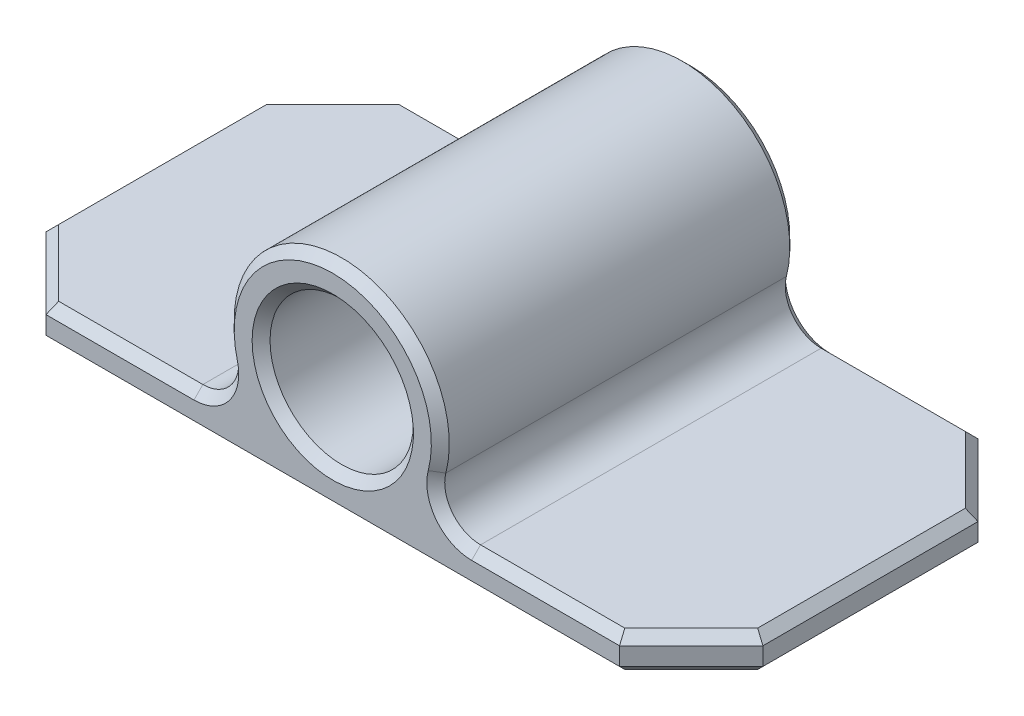
ISO-10303-21;
HEADER;
FILE_DESCRIPTION(('STEP AP214'),'2;1');
FILE_NAME('part.step','',(''),(''),'','','');
FILE_SCHEMA(('AUTOMOTIVE_DESIGN { 1 0 10303 214 1 1 1 1 }'));
ENDSEC;
DATA;
#1=APPLICATION_CONTEXT('core data for automotive mechanical design processes');
#2=APPLICATION_PROTOCOL_DEFINITION('international standard','automotive_design',2000,#1);
#3=PRODUCT_CONTEXT('',#1,'mechanical');
#4=PRODUCT('Part','Part','',(#3));
#5=PRODUCT_RELATED_PRODUCT_CATEGORY('part','',(#4));
#6=PRODUCT_DEFINITION_FORMATION('','',#4);
#7=PRODUCT_DEFINITION_CONTEXT('part definition',#1,'design');
#8=PRODUCT_DEFINITION('design','',#6,#7);
#9=PRODUCT_DEFINITION_SHAPE('','',#8);
#10=(LENGTH_UNIT() NAMED_UNIT(*) SI_UNIT(.MILLI.,.METRE.));
#11=(NAMED_UNIT(*) PLANE_ANGLE_UNIT() SI_UNIT($,.RADIAN.));
#12=(NAMED_UNIT(*) SI_UNIT($,.STERADIAN.) SOLID_ANGLE_UNIT());
#13=UNCERTAINTY_MEASURE_WITH_UNIT(LENGTH_MEASURE(1.E-05),#10,'distance_accuracy_value','');
#14=(GEOMETRIC_REPRESENTATION_CONTEXT(3) GLOBAL_UNCERTAINTY_ASSIGNED_CONTEXT((#13)) GLOBAL_UNIT_ASSIGNED_CONTEXT((#10,
#11,#12)) REPRESENTATION_CONTEXT('',''));
#15=CARTESIAN_POINT('',(0.,0.,0.));
#16=DIRECTION('',(0.,0.,1.));
#17=DIRECTION('',(1.,0.,0.));
#18=AXIS2_PLACEMENT_3D('',#15,#16,#17);
#19=CARTESIAN_POINT('',(0.,0.,10.));
#20=DIRECTION('',(0.,0.,-1.));
#21=DIRECTION('',(-1.,0.,0.));
#22=AXIS2_PLACEMENT_3D('',#19,#20,#21);
#23=CYLINDRICAL_SURFACE('',#22,1.);
#24=CARTESIAN_POINT('',(0.,0.,0.250000000000002));
#25=DIRECTION('',(0.,0.,-1.));
#26=DIRECTION('',(-1.,0.,0.));
#27=AXIS2_PLACEMENT_3D('',#24,#25,#26);
#28=CIRCLE('',#27,1.);
#29=CARTESIAN_POINT('',(-1.,0.,0.250000000000002));
#30=VERTEX_POINT('',#29);
#31=EDGE_CURVE('E348',#30,#30,#28,.T.);
#32=ORIENTED_EDGE('',*,*,#31,.T.);
#33=EDGE_LOOP('',(#32));
#34=FACE_BOUND('',#33,.T.);
#35=CARTESIAN_POINT('',(0.,0.,2.));
#36=DIRECTION('',(0.,0.,1.));
#37=DIRECTION('',(1.,0.,0.));
#38=AXIS2_PLACEMENT_3D('',#35,#36,#37);
#39=CIRCLE('',#38,1.);
#40=CARTESIAN_POINT('',(1.,0.,2.));
#41=VERTEX_POINT('',#40);
#42=EDGE_CURVE('E426',#41,#41,#39,.T.);
#43=ORIENTED_EDGE('',*,*,#42,.T.);
#44=EDGE_LOOP('',(#43));
#45=FACE_BOUND('',#44,.T.);
#46=ADVANCED_FACE('F33',(#34,#45),#23,.F.);
#47=CARTESIAN_POINT('',(-3.87298334620742,-1.,10.));
#48=DIRECTION('',(0.,0.,-1.));
#49=DIRECTION('',(-1.,0.,0.));
#50=AXIS2_PLACEMENT_3D('',#47,#48,#49);
#51=PLANE('',#50);
#52=CARTESIAN_POINT('',(0.,0.,10.));
#53=DIRECTION('',(0.,0.,-1.));
#54=DIRECTION('',(-1.,0.,0.));
#55=AXIS2_PLACEMENT_3D('',#52,#53,#54);
#56=CIRCLE('',#55,2.25000000000001);
#57=CARTESIAN_POINT('',(-2.25000000000001,0.,10.));
#58=VERTEX_POINT('',#57);
#59=EDGE_CURVE('E366',#58,#58,#56,.T.);
#60=ORIENTED_EDGE('',*,*,#59,.T.);
#61=EDGE_LOOP('',(#60));
#62=FACE_BOUND('',#61,.T.);
#63=CARTESIAN_POINT('',(-3.87298334620742,-1.,10.));
#64=DIRECTION('',(0.,0.,-1.));
#65=DIRECTION('',(-1.,0.,0.));
#66=AXIS2_PLACEMENT_3D('',#63,#64,#65);
#67=CIRCLE('',#66,1.25);
#68=CARTESIAN_POINT('',(-2.6626760505176,-0.687499999999996,10.));
#69=VERTEX_POINT('',#68);
#70=CARTESIAN_POINT('',(-3.87298334620742,-2.25,10.));
#71=VERTEX_POINT('',#70);
#72=EDGE_CURVE('E370',#69,#71,#67,.T.);
#73=ORIENTED_EDGE('',*,*,#72,.T.);
#74=DIRECTION('',(-1.,0.,0.));
#75=VECTOR('',#74,1.);
#76=CARTESIAN_POINT('',(-3.87298334620742,-2.25,10.));
#77=LINE('',#76,#75);
#78=CARTESIAN_POINT('',(-7.99999999999999,-2.25,10.));
#79=VERTEX_POINT('',#78);
#80=EDGE_CURVE('E232',#71,#79,#77,.T.);
#81=ORIENTED_EDGE('',*,*,#80,.T.);
#82=DIRECTION('',(0.,-1.,0.));
#83=VECTOR('',#82,1.);
#84=CARTESIAN_POINT('',(-7.99999999999999,-1.,10.));
#85=LINE('',#84,#83);
#86=CARTESIAN_POINT('',(-7.99999999999999,-2.75,10.));
#87=VERTEX_POINT('',#86);
#88=EDGE_CURVE('E421',#79,#87,#85,.T.);
#89=ORIENTED_EDGE('',*,*,#88,.T.);
#90=DIRECTION('',(1.,0.,0.));
#91=VECTOR('',#90,1.);
#92=CARTESIAN_POINT('',(-3.87298334620742,-2.75,10.));
#93=LINE('',#92,#91);
#94=CARTESIAN_POINT('',(7.99999999999999,-2.74999999999999,10.));
#95=VERTEX_POINT('',#94);
#96=EDGE_CURVE('E378',#87,#95,#93,.T.);
#97=ORIENTED_EDGE('',*,*,#96,.T.);
#98=DIRECTION('',(0.,1.,0.));
#99=VECTOR('',#98,1.);
#100=CARTESIAN_POINT('',(7.99999999999999,-1.,10.));
#101=LINE('',#100,#99);
#102=CARTESIAN_POINT('',(7.99999999999999,-2.25,10.));
#103=VERTEX_POINT('',#102);
#104=EDGE_CURVE('E217',#95,#103,#101,.T.);
#105=ORIENTED_EDGE('',*,*,#104,.T.);
#106=DIRECTION('',(-1.,0.,0.));
#107=VECTOR('',#106,1.);
#108=CARTESIAN_POINT('',(-3.87298334620742,-2.25000000000001,10.));
#109=LINE('',#108,#107);
#110=CARTESIAN_POINT('',(3.87298334620742,-2.25,10.));
#111=VERTEX_POINT('',#110);
#112=EDGE_CURVE('E376',#103,#111,#109,.T.);
#113=ORIENTED_EDGE('',*,*,#112,.T.);
#114=CARTESIAN_POINT('',(3.87298334620742,-1.,10.));
#115=DIRECTION('',(0.,0.,-1.));
#116=DIRECTION('',(-1.,0.,0.));
#117=AXIS2_PLACEMENT_3D('',#114,#115,#116);
#118=CIRCLE('',#117,1.25);
#119=CARTESIAN_POINT('',(2.66267605051759,-0.6875,10.));
#120=VERTEX_POINT('',#119);
#121=EDGE_CURVE('E374',#111,#120,#118,.T.);
#122=ORIENTED_EDGE('',*,*,#121,.T.);
#123=CARTESIAN_POINT('',(0.,0.,10.));
#124=DIRECTION('',(0.,0.,-1.));
#125=DIRECTION('',(-1.,0.,0.));
#126=AXIS2_PLACEMENT_3D('',#123,#124,#125);
#127=CIRCLE('',#126,2.75);
#128=EDGE_CURVE('E372',#120,#69,#127,.F.);
#129=ORIENTED_EDGE('',*,*,#128,.T.);
#130=EDGE_LOOP('',(#73,#81,#89,#97,#105,#113,#122,#129));
#131=FACE_BOUND('',#130,.T.);
#132=ADVANCED_FACE('F458',(#62,#131),#51,.F.);
#133=CARTESIAN_POINT('',(-3.87298334620742,-1.,0.));
#134=DIRECTION('',(0.,0.,-1.));
#135=DIRECTION('',(-1.,0.,0.));
#136=AXIS2_PLACEMENT_3D('',#133,#134,#135);
#137=PLANE('',#136);
#138=CARTESIAN_POINT('',(0.,0.,0.));
#139=DIRECTION('',(0.,0.,-1.));
#140=DIRECTION('',(-1.,0.,0.));
#141=AXIS2_PLACEMENT_3D('',#138,#139,#140);
#142=CIRCLE('',#141,1.25);
#143=CARTESIAN_POINT('',(-1.25,0.,0.));
#144=VERTEX_POINT('',#143);
#145=EDGE_CURVE('E351',#144,#144,#142,.F.);
#146=ORIENTED_EDGE('',*,*,#145,.T.);
#147=EDGE_LOOP('',(#146));
#148=FACE_BOUND('',#147,.T.);
#149=DIRECTION('',(0.,1.,0.));
#150=VECTOR('',#149,1.);
#151=CARTESIAN_POINT('',(-7.99999999999999,-2.,0.));
#152=LINE('',#151,#150);
#153=CARTESIAN_POINT('',(-7.99999999999999,-2.75,0.));
#154=VERTEX_POINT('',#153);
#155=CARTESIAN_POINT('',(-7.99999999999999,-2.25,0.));
#156=VERTEX_POINT('',#155);
#157=EDGE_CURVE('E409',#154,#156,#152,.T.);
#158=ORIENTED_EDGE('',*,*,#157,.T.);
#159=DIRECTION('',(1.,0.,0.));
#160=VECTOR('',#159,1.);
#161=CARTESIAN_POINT('',(-3.87298334620742,-2.25,0.));
#162=LINE('',#161,#160);
#163=CARTESIAN_POINT('',(-3.87298334620742,-2.25,0.));
#164=VERTEX_POINT('',#163);
#165=EDGE_CURVE('E354',#156,#164,#162,.T.);
#166=ORIENTED_EDGE('',*,*,#165,.T.);
#167=CARTESIAN_POINT('',(-3.87298334620742,-1.,0.));
#168=DIRECTION('',(0.,0.,-1.));
#169=DIRECTION('',(-1.,0.,0.));
#170=AXIS2_PLACEMENT_3D('',#167,#168,#169);
#171=CIRCLE('',#170,1.25);
#172=CARTESIAN_POINT('',(-2.6626760505176,-0.687499999999996,0.));
#173=VERTEX_POINT('',#172);
#174=EDGE_CURVE('E356',#164,#173,#171,.F.);
#175=ORIENTED_EDGE('',*,*,#174,.T.);
#176=CARTESIAN_POINT('',(0.,0.,0.));
#177=DIRECTION('',(0.,0.,-1.));
#178=DIRECTION('',(-1.,0.,0.));
#179=AXIS2_PLACEMENT_3D('',#176,#177,#178);
#180=CIRCLE('',#179,2.75);
#181=CARTESIAN_POINT('',(2.6626760505176,-0.6875,0.));
#182=VERTEX_POINT('',#181);
#183=EDGE_CURVE('E358',#173,#182,#180,.T.);
#184=ORIENTED_EDGE('',*,*,#183,.T.);
#185=CARTESIAN_POINT('',(3.87298334620742,-1.,0.));
#186=DIRECTION('',(0.,0.,-1.));
#187=DIRECTION('',(-1.,0.,0.));
#188=AXIS2_PLACEMENT_3D('',#185,#186,#187);
#189=CIRCLE('',#188,1.25);
#190=CARTESIAN_POINT('',(3.87298334620742,-2.25,0.));
#191=VERTEX_POINT('',#190);
#192=EDGE_CURVE('E360',#182,#191,#189,.F.);
#193=ORIENTED_EDGE('',*,*,#192,.T.);
#194=DIRECTION('',(1.,0.,0.));
#195=VECTOR('',#194,1.);
#196=CARTESIAN_POINT('',(7.99999999999999,-2.25,0.));
#197=LINE('',#196,#195);
#198=CARTESIAN_POINT('',(7.99999999999999,-2.25,0.));
#199=VERTEX_POINT('',#198);
#200=EDGE_CURVE('E362',#191,#199,#197,.T.);
#201=ORIENTED_EDGE('',*,*,#200,.T.);
#202=DIRECTION('',(0.,-1.,0.));
#203=VECTOR('',#202,1.);
#204=CARTESIAN_POINT('',(7.99999999999999,-3.,0.));
#205=LINE('',#204,#203);
#206=CARTESIAN_POINT('',(7.99999999999999,-2.74999999999999,0.));
#207=VERTEX_POINT('',#206);
#208=EDGE_CURVE('E412',#199,#207,#205,.T.);
#209=ORIENTED_EDGE('',*,*,#208,.T.);
#210=DIRECTION('',(-1.,0.,0.));
#211=VECTOR('',#210,1.);
#212=CARTESIAN_POINT('',(-7.99999999999999,-2.75,0.));
#213=LINE('',#212,#211);
#214=EDGE_CURVE('E364',#207,#154,#213,.T.);
#215=ORIENTED_EDGE('',*,*,#214,.T.);
#216=EDGE_LOOP('',(#158,#166,#175,#184,#193,#201,#209,#215));
#217=FACE_BOUND('',#216,.T.);
#218=ADVANCED_FACE('F463',(#148,#217),#137,.T.);
#219=CARTESIAN_POINT('',(-3.87298334620742,-1.,10.));
#220=DIRECTION('',(0.,0.,-1.));
#221=DIRECTION('',(-1.,0.,0.));
#222=AXIS2_PLACEMENT_3D('',#219,#220,#221);
#223=CYLINDRICAL_SURFACE('',#222,1.);
#224=DIRECTION('',(0.,0.,-1.));
#225=VECTOR('',#224,1.);
#226=CARTESIAN_POINT('',(-3.87298334620742,-2.,10.));
#227=LINE('',#226,#225);
#228=CARTESIAN_POINT('',(-3.87298334620742,-2.,9.75));
#229=VERTEX_POINT('',#228);
#230=CARTESIAN_POINT('',(-3.87298334620742,-2.,0.250000000000004));
#231=VERTEX_POINT('',#230);
#232=EDGE_CURVE('E200',#229,#231,#227,.T.);
#233=ORIENTED_EDGE('',*,*,#232,.F.);
#234=CARTESIAN_POINT('',(-3.87298334620742,-1.,9.75));
#235=DIRECTION('',(0.,0.,-1.));
#236=DIRECTION('',(-1.,0.,0.));
#237=AXIS2_PLACEMENT_3D('',#234,#235,#236);
#238=CIRCLE('',#237,1.);
#239=CARTESIAN_POINT('',(-2.90473750965556,-0.749999999999998,9.75));
#240=VERTEX_POINT('',#239);
#241=EDGE_CURVE('E213',#229,#240,#238,.F.);
#242=ORIENTED_EDGE('',*,*,#241,.T.);
#243=DIRECTION('',(0.,0.,-1.));
#244=VECTOR('',#243,1.);
#245=CARTESIAN_POINT('',(-2.90473750965556,-0.749999999999998,10.));
#246=LINE('',#245,#244);
#247=CARTESIAN_POINT('',(-2.90473750965556,-0.749999999999998,0.250000000000004));
#248=VERTEX_POINT('',#247);
#249=EDGE_CURVE('E428',#240,#248,#246,.T.);
#250=ORIENTED_EDGE('',*,*,#249,.T.);
#251=CARTESIAN_POINT('',(-3.87298334620742,-1.,0.250000000000004));
#252=DIRECTION('',(0.,0.,-1.));
#253=DIRECTION('',(-1.,0.,0.));
#254=AXIS2_PLACEMENT_3D('',#251,#252,#253);
#255=CIRCLE('',#254,1.);
#256=EDGE_CURVE('E216',#248,#231,#255,.T.);
#257=ORIENTED_EDGE('',*,*,#256,.T.);
#258=EDGE_LOOP('',(#233,#242,#250,#257));
#259=FACE_BOUND('',#258,.T.);
#260=ADVANCED_FACE('F211',(#259),#223,.F.);
#261=CARTESIAN_POINT('',(-10.,-2.,10.));
#262=DIRECTION('',(0.,-1.,0.));
#263=DIRECTION('',(0.,0.,-1.));
#264=AXIS2_PLACEMENT_3D('',#261,#262,#263);
#265=PLANE('',#264);
#266=DIRECTION('',(0.707106781186546,0.,0.707106781186549));
#267=VECTOR('',#266,1.);
#268=CARTESIAN_POINT('',(-7.82322330470335,-2.,9.82322330470336));
#269=LINE('',#268,#267);
#270=CARTESIAN_POINT('',(-9.75,-2.,7.89644660940671));
#271=VERTEX_POINT('',#270);
#272=CARTESIAN_POINT('',(-7.89644660940672,-2.,9.75));
#273=VERTEX_POINT('',#272);
#274=EDGE_CURVE('E203',#271,#273,#269,.T.);
#275=ORIENTED_EDGE('',*,*,#274,.T.);
#276=DIRECTION('',(1.,0.,0.));
#277=VECTOR('',#276,1.);
#278=CARTESIAN_POINT('',(-10.,-2.,9.75));
#279=LINE('',#278,#277);
#280=EDGE_CURVE('E197',#273,#229,#279,.T.);
#281=ORIENTED_EDGE('',*,*,#280,.T.);
#282=ORIENTED_EDGE('',*,*,#232,.T.);
#283=DIRECTION('',(-1.,0.,0.));
#284=VECTOR('',#283,1.);
#285=CARTESIAN_POINT('',(-7.99999999999999,-2.,0.250000000000004));
#286=LINE('',#285,#284);
#287=CARTESIAN_POINT('',(-7.89644660940672,-2.,0.250000000000004));
#288=VERTEX_POINT('',#287);
#289=EDGE_CURVE('E401',#231,#288,#286,.T.);
#290=ORIENTED_EDGE('',*,*,#289,.T.);
#291=DIRECTION('',(-0.707106781186548,0.,0.707106781186547));
#292=VECTOR('',#291,1.);
#293=CARTESIAN_POINT('',(-9.82322330470336,-2.,2.17677669529664));
#294=LINE('',#293,#292);
#295=CARTESIAN_POINT('',(-9.75,-2.,2.10355339059328));
#296=VERTEX_POINT('',#295);
#297=EDGE_CURVE('E399',#288,#296,#294,.T.);
#298=ORIENTED_EDGE('',*,*,#297,.T.);
#299=DIRECTION('',(0.,0.,1.));
#300=VECTOR('',#299,1.);
#301=CARTESIAN_POINT('',(-9.75,-2.,10.));
#302=LINE('',#301,#300);
#303=EDGE_CURVE('E397',#296,#271,#302,.T.);
#304=ORIENTED_EDGE('',*,*,#303,.T.);
#305=EDGE_LOOP('',(#275,#281,#282,#290,#298,#304));
#306=FACE_BOUND('',#305,.T.);
#307=ADVANCED_FACE('F199',(#306),#265,.F.);
#308=CARTESIAN_POINT('',(-10.,-2.,10.));
#309=DIRECTION('',(1.,0.,0.));
#310=DIRECTION('',(0.,0.,-1.));
#311=AXIS2_PLACEMENT_3D('',#308,#309,#310);
#312=PLANE('',#311);
#313=DIRECTION('',(0.,1.,0.));
#314=VECTOR('',#313,1.);
#315=CARTESIAN_POINT('',(-10.,-2.,7.99999999999998));
#316=LINE('',#315,#314);
#317=CARTESIAN_POINT('',(-10.,-2.75,7.99999999999998));
#318=VERTEX_POINT('',#317);
#319=CARTESIAN_POINT('',(-10.,-2.25,7.99999999999998));
#320=VERTEX_POINT('',#319);
#321=EDGE_CURVE('E415',#318,#320,#316,.T.);
#322=ORIENTED_EDGE('',*,*,#321,.T.);
#323=DIRECTION('',(0.,0.,-1.));
#324=VECTOR('',#323,1.);
#325=CARTESIAN_POINT('',(-10.,-2.25,10.));
#326=LINE('',#325,#324);
#327=CARTESIAN_POINT('',(-10.,-2.25,2.00000000000001));
#328=VERTEX_POINT('',#327);
#329=EDGE_CURVE('E387',#320,#328,#326,.T.);
#330=ORIENTED_EDGE('',*,*,#329,.T.);
#331=DIRECTION('',(0.,-1.,0.));
#332=VECTOR('',#331,1.);
#333=CARTESIAN_POINT('',(-10.,-3.,2.00000000000001));
#334=LINE('',#333,#332);
#335=CARTESIAN_POINT('',(-10.,-2.75,2.00000000000001));
#336=VERTEX_POINT('',#335);
#337=EDGE_CURVE('E418',#328,#336,#334,.T.);
#338=ORIENTED_EDGE('',*,*,#337,.T.);
#339=DIRECTION('',(0.,0.,1.));
#340=VECTOR('',#339,1.);
#341=CARTESIAN_POINT('',(-10.,-2.75,10.));
#342=LINE('',#341,#340);
#343=EDGE_CURVE('E389',#336,#318,#342,.T.);
#344=ORIENTED_EDGE('',*,*,#343,.T.);
#345=EDGE_LOOP('',(#322,#330,#338,#344));
#346=FACE_BOUND('',#345,.T.);
#347=ADVANCED_FACE('F485',(#346),#312,.F.);
#348=CARTESIAN_POINT('',(-10.,-3.,10.));
#349=DIRECTION('',(0.,1.,0.));
#350=DIRECTION('',(-1.,0.,0.));
#351=AXIS2_PLACEMENT_3D('',#348,#349,#350);
#352=PLANE('',#351);
#353=DIRECTION('',(-1.,0.,0.));
#354=VECTOR('',#353,1.);
#355=CARTESIAN_POINT('',(-10.,-3.,9.75));
#356=LINE('',#355,#354);
#357=CARTESIAN_POINT('',(7.89644660940671,-3.,9.75));
#358=VERTEX_POINT('',#357);
#359=CARTESIAN_POINT('',(-7.89644660940672,-3.,9.75));
#360=VERTEX_POINT('',#359);
#361=EDGE_CURVE('E308',#358,#360,#356,.T.);
#362=ORIENTED_EDGE('',*,*,#361,.T.);
#363=DIRECTION('',(-0.707106781186546,0.,-0.707106781186549));
#364=VECTOR('',#363,1.);
#365=CARTESIAN_POINT('',(-9.82322330470336,-3.,7.82322330470334));
#366=LINE('',#365,#364);
#367=CARTESIAN_POINT('',(-9.75,-3.,7.89644660940671));
#368=VERTEX_POINT('',#367);
#369=EDGE_CURVE('E11',#360,#368,#366,.T.);
#370=ORIENTED_EDGE('',*,*,#369,.T.);
#371=DIRECTION('',(0.,0.,-1.));
#372=VECTOR('',#371,1.);
#373=CARTESIAN_POINT('',(-9.75,-3.,10.));
#374=LINE('',#373,#372);
#375=CARTESIAN_POINT('',(-9.75,-3.,2.10355339059328));
#376=VERTEX_POINT('',#375);
#377=EDGE_CURVE('E42',#368,#376,#374,.T.);
#378=ORIENTED_EDGE('',*,*,#377,.T.);
#379=DIRECTION('',(0.707106781186548,0.,-0.707106781186547));
#380=VECTOR('',#379,1.);
#381=CARTESIAN_POINT('',(-7.82322330470335,-3.,0.17677669529664));
#382=LINE('',#381,#380);
#383=CARTESIAN_POINT('',(-7.89644660940672,-3.,0.250000000000004));
#384=VERTEX_POINT('',#383);
#385=EDGE_CURVE('E306',#376,#384,#382,.T.);
#386=ORIENTED_EDGE('',*,*,#385,.T.);
#387=DIRECTION('',(1.,0.,0.));
#388=VECTOR('',#387,1.);
#389=CARTESIAN_POINT('',(7.99999999999999,-3.,0.250000000000004));
#390=LINE('',#389,#388);
#391=CARTESIAN_POINT('',(7.89644660940672,-3.,0.250000000000004));
#392=VERTEX_POINT('',#391);
#393=EDGE_CURVE('E316',#384,#392,#390,.T.);
#394=ORIENTED_EDGE('',*,*,#393,.T.);
#395=DIRECTION('',(0.707106781186548,0.,0.707106781186547));
#396=VECTOR('',#395,1.);
#397=CARTESIAN_POINT('',(9.82322330470336,-3.,2.17677669529665));
#398=LINE('',#397,#396);
#399=CARTESIAN_POINT('',(9.75,-3.,2.10355339059328));
#400=VERTEX_POINT('',#399);
#401=EDGE_CURVE('E314',#392,#400,#398,.T.);
#402=ORIENTED_EDGE('',*,*,#401,.T.);
#403=DIRECTION('',(0.,0.,1.));
#404=VECTOR('',#403,1.);
#405=CARTESIAN_POINT('',(9.75,-3.,10.));
#406=LINE('',#405,#404);
#407=CARTESIAN_POINT('',(9.75,-3.,7.89644660940671));
#408=VERTEX_POINT('',#407);
#409=EDGE_CURVE('E312',#400,#408,#406,.T.);
#410=ORIENTED_EDGE('',*,*,#409,.T.);
#411=DIRECTION('',(-0.707106781186546,0.,0.707106781186549));
#412=VECTOR('',#411,1.);
#413=CARTESIAN_POINT('',(7.82322330470335,-3.,9.82322330470336));
#414=LINE('',#413,#412);
#415=EDGE_CURVE('E310',#408,#358,#414,.T.);
#416=ORIENTED_EDGE('',*,*,#415,.T.);
#417=EDGE_LOOP('',(#362,#370,#378,#386,#394,#402,#410,#416));
#418=FACE_BOUND('',#417,.T.);
#419=ADVANCED_FACE('F481',(#418),#352,.F.);
#420=CARTESIAN_POINT('',(10.,-2.,10.));
#421=DIRECTION('',(-1.,0.,0.));
#422=DIRECTION('',(0.,0.,1.));
#423=AXIS2_PLACEMENT_3D('',#420,#421,#422);
#424=PLANE('',#423);
#425=DIRECTION('',(0.,1.,0.));
#426=VECTOR('',#425,1.);
#427=CARTESIAN_POINT('',(10.,-2.,2.00000000000001));
#428=LINE('',#427,#426);
#429=CARTESIAN_POINT('',(10.,-2.74999999999999,2.00000000000001));
#430=VERTEX_POINT('',#429);
#431=CARTESIAN_POINT('',(10.,-2.25,2.00000000000001));
#432=VERTEX_POINT('',#431);
#433=EDGE_CURVE('E403',#430,#432,#428,.T.);
#434=ORIENTED_EDGE('',*,*,#433,.T.);
#435=DIRECTION('',(0.,0.,1.));
#436=VECTOR('',#435,1.);
#437=CARTESIAN_POINT('',(10.,-2.25,10.));
#438=LINE('',#437,#436);
#439=CARTESIAN_POINT('',(10.,-2.25,7.99999999999998));
#440=VERTEX_POINT('',#439);
#441=EDGE_CURVE('E322',#432,#440,#438,.T.);
#442=ORIENTED_EDGE('',*,*,#441,.T.);
#443=DIRECTION('',(0.,-1.,0.));
#444=VECTOR('',#443,1.);
#445=CARTESIAN_POINT('',(10.,-2.,7.99999999999998));
#446=LINE('',#445,#444);
#447=CARTESIAN_POINT('',(10.,-2.74999999999999,7.99999999999998));
#448=VERTEX_POINT('',#447);
#449=EDGE_CURVE('E406',#440,#448,#446,.T.);
#450=ORIENTED_EDGE('',*,*,#449,.T.);
#451=DIRECTION('',(0.,0.,-1.));
#452=VECTOR('',#451,1.);
#453=CARTESIAN_POINT('',(10.,-2.74999999999999,10.));
#454=LINE('',#453,#452);
#455=EDGE_CURVE('E324',#448,#430,#454,.T.);
#456=ORIENTED_EDGE('',*,*,#455,.T.);
#457=EDGE_LOOP('',(#434,#442,#450,#456));
#458=FACE_BOUND('',#457,.T.);
#459=ADVANCED_FACE('F477',(#458),#424,.F.);
#460=CARTESIAN_POINT('',(3.87298334620742,-2.,10.));
#461=DIRECTION('',(0.,-1.,0.));
#462=DIRECTION('',(1.,0.,0.));
#463=AXIS2_PLACEMENT_3D('',#460,#461,#462);
#464=PLANE('',#463);
#465=DIRECTION('',(0.,0.,-1.));
#466=VECTOR('',#465,1.);
#467=CARTESIAN_POINT('',(3.87298334620742,-2.,10.));
#468=LINE('',#467,#466);
#469=CARTESIAN_POINT('',(3.87298334620742,-2.,9.75));
#470=VERTEX_POINT('',#469);
#471=CARTESIAN_POINT('',(3.87298334620742,-2.,0.250000000000004));
#472=VERTEX_POINT('',#471);
#473=EDGE_CURVE('E218',#470,#472,#468,.T.);
#474=ORIENTED_EDGE('',*,*,#473,.F.);
#475=DIRECTION('',(1.,0.,0.));
#476=VECTOR('',#475,1.);
#477=CARTESIAN_POINT('',(3.87298334620742,-2.,9.75));
#478=LINE('',#477,#476);
#479=CARTESIAN_POINT('',(7.89644660940672,-2.,9.75));
#480=VERTEX_POINT('',#479);
#481=EDGE_CURVE('E330',#470,#480,#478,.T.);
#482=ORIENTED_EDGE('',*,*,#481,.T.);
#483=DIRECTION('',(0.707106781186546,0.,-0.707106781186549));
#484=VECTOR('',#483,1.);
#485=CARTESIAN_POINT('',(9.82322330470336,-2.,7.82322330470334));
#486=LINE('',#485,#484);
#487=CARTESIAN_POINT('',(9.75,-2.,7.89644660940671));
#488=VERTEX_POINT('',#487);
#489=EDGE_CURVE('E332',#480,#488,#486,.T.);
#490=ORIENTED_EDGE('',*,*,#489,.T.);
#491=DIRECTION('',(0.,0.,-1.));
#492=VECTOR('',#491,1.);
#493=CARTESIAN_POINT('',(9.75,-2.,10.));
#494=LINE('',#493,#492);
#495=CARTESIAN_POINT('',(9.75,-2.,2.10355339059328));
#496=VERTEX_POINT('',#495);
#497=EDGE_CURVE('E334',#488,#496,#494,.T.);
#498=ORIENTED_EDGE('',*,*,#497,.T.);
#499=DIRECTION('',(-0.707106781186548,0.,-0.707106781186547));
#500=VECTOR('',#499,1.);
#501=CARTESIAN_POINT('',(7.82322330470335,-2.,0.17677669529664));
#502=LINE('',#501,#500);
#503=CARTESIAN_POINT('',(7.89644660940672,-2.,0.250000000000004));
#504=VERTEX_POINT('',#503);
#505=EDGE_CURVE('E336',#496,#504,#502,.T.);
#506=ORIENTED_EDGE('',*,*,#505,.T.);
#507=DIRECTION('',(-1.,0.,0.));
#508=VECTOR('',#507,1.);
#509=CARTESIAN_POINT('',(3.87298334620742,-2.,0.250000000000004));
#510=LINE('',#509,#508);
#511=EDGE_CURVE('E338',#504,#472,#510,.T.);
#512=ORIENTED_EDGE('',*,*,#511,.T.);
#513=EDGE_LOOP('',(#474,#482,#490,#498,#506,#512));
#514=FACE_BOUND('',#513,.T.);
#515=ADVANCED_FACE('F473',(#514),#464,.F.);
#516=CARTESIAN_POINT('',(3.87298334620742,-1.,10.));
#517=DIRECTION('',(0.,0.,-1.));
#518=DIRECTION('',(-1.,0.,0.));
#519=AXIS2_PLACEMENT_3D('',#516,#517,#518);
#520=CYLINDRICAL_SURFACE('',#519,1.);
#521=DIRECTION('',(0.,0.,-1.));
#522=VECTOR('',#521,1.);
#523=CARTESIAN_POINT('',(2.90473750965556,-0.750000000000001,10.));
#524=LINE('',#523,#522);
#525=CARTESIAN_POINT('',(2.90473750965556,-0.750000000000001,9.75));
#526=VERTEX_POINT('',#525);
#527=CARTESIAN_POINT('',(2.90473750965556,-0.750000000000001,0.250000000000004));
#528=VERTEX_POINT('',#527);
#529=EDGE_CURVE('E432',#526,#528,#524,.T.);
#530=ORIENTED_EDGE('',*,*,#529,.F.);
#531=CARTESIAN_POINT('',(3.87298334620742,-1.,9.75));
#532=DIRECTION('',(0.,0.,-1.));
#533=DIRECTION('',(-1.,0.,0.));
#534=AXIS2_PLACEMENT_3D('',#531,#532,#533);
#535=CIRCLE('',#534,1.);
#536=EDGE_CURVE('E340',#526,#470,#535,.F.);
#537=ORIENTED_EDGE('',*,*,#536,.T.);
#538=ORIENTED_EDGE('',*,*,#473,.T.);
#539=CARTESIAN_POINT('',(3.87298334620742,-1.,0.250000000000004));
#540=DIRECTION('',(0.,0.,-1.));
#541=DIRECTION('',(-1.,0.,0.));
#542=AXIS2_PLACEMENT_3D('',#539,#540,#541);
#543=CIRCLE('',#542,1.);
#544=EDGE_CURVE('E342',#472,#528,#543,.T.);
#545=ORIENTED_EDGE('',*,*,#544,.T.);
#546=EDGE_LOOP('',(#530,#537,#538,#545));
#547=FACE_BOUND('',#546,.T.);
#548=ADVANCED_FACE('F453',(#547),#520,.F.);
#549=CARTESIAN_POINT('',(0.,0.,10.));
#550=DIRECTION('',(0.,0.,-1.));
#551=DIRECTION('',(-1.,0.,0.));
#552=AXIS2_PLACEMENT_3D('',#549,#550,#551);
#553=CYLINDRICAL_SURFACE('',#552,3.);
#554=ORIENTED_EDGE('',*,*,#249,.F.);
#555=CARTESIAN_POINT('',(0.,0.,9.75));
#556=DIRECTION('',(0.,0.,-1.));
#557=DIRECTION('',(-1.,0.,0.));
#558=AXIS2_PLACEMENT_3D('',#555,#556,#557);
#559=CIRCLE('',#558,3.);
#560=EDGE_CURVE('E344',#240,#526,#559,.T.);
#561=ORIENTED_EDGE('',*,*,#560,.T.);
#562=ORIENTED_EDGE('',*,*,#529,.T.);
#563=CARTESIAN_POINT('',(0.,0.,0.250000000000004));
#564=DIRECTION('',(0.,0.,-1.));
#565=DIRECTION('',(-1.,0.,0.));
#566=AXIS2_PLACEMENT_3D('',#563,#564,#565);
#567=CIRCLE('',#566,3.);
#568=EDGE_CURVE('E229',#528,#248,#567,.F.);
#569=ORIENTED_EDGE('',*,*,#568,.T.);
#570=EDGE_LOOP('',(#554,#561,#562,#569));
#571=FACE_BOUND('',#570,.T.);
#572=ADVANCED_FACE('F443',(#571),#553,.T.);
#573=CARTESIAN_POINT('',(0.,0.,2.));
#574=DIRECTION('',(0.,0.,1.));
#575=DIRECTION('',(1.,0.,0.));
#576=AXIS2_PLACEMENT_3D('',#573,#574,#575);
#577=CYLINDRICAL_SURFACE('',#576,2.);
#578=CARTESIAN_POINT('',(0.,0.,9.74999999999999));
#579=DIRECTION('',(0.,0.,-1.));
#580=DIRECTION('',(-1.,0.,0.));
#581=AXIS2_PLACEMENT_3D('',#578,#579,#580);
#582=CIRCLE('',#581,2.);
#583=CARTESIAN_POINT('',(-2.,0.,9.74999999999999));
#584=VERTEX_POINT('',#583);
#585=EDGE_CURVE('E380',#584,#584,#582,.F.);
#586=ORIENTED_EDGE('',*,*,#585,.T.);
#587=EDGE_LOOP('',(#586));
#588=FACE_BOUND('',#587,.T.);
#589=CARTESIAN_POINT('',(0.,0.,2.));
#590=DIRECTION('',(0.,0.,1.));
#591=DIRECTION('',(1.,0.,0.));
#592=AXIS2_PLACEMENT_3D('',#589,#590,#591);
#593=CIRCLE('',#592,2.);
#594=CARTESIAN_POINT('',(2.,0.,2.));
#595=VERTEX_POINT('',#594);
#596=EDGE_CURVE('E276',#595,#595,#593,.T.);
#597=ORIENTED_EDGE('',*,*,#596,.F.);
#598=EDGE_LOOP('',(#597));
#599=FACE_BOUND('',#598,.T.);
#600=ADVANCED_FACE('F441',(#588,#599),#577,.F.);
#601=CARTESIAN_POINT('',(0.,0.,2.));
#602=DIRECTION('',(0.,0.,1.));
#603=DIRECTION('',(1.,0.,0.));
#604=AXIS2_PLACEMENT_3D('',#601,#602,#603);
#605=PLANE('',#604);
#606=ORIENTED_EDGE('',*,*,#42,.F.);
#607=EDGE_LOOP('',(#606));
#608=FACE_BOUND('',#607,.T.);
#609=ORIENTED_EDGE('',*,*,#596,.T.);
#610=EDGE_LOOP('',(#609));
#611=FACE_BOUND('',#610,.T.);
#612=ADVANCED_FACE('F439',(#608,#611),#605,.T.);
#613=CARTESIAN_POINT('',(-7.99999999999999,-1.,10.));
#614=DIRECTION('',(0.707106781186549,0.,-0.707106781186546));
#615=DIRECTION('',(-0.707106781186546,0.,-0.707106781186549));
#616=AXIS2_PLACEMENT_3D('',#613,#614,#615);
#617=PLANE('',#616);
#618=ORIENTED_EDGE('',*,*,#88,.F.);
#619=DIRECTION('',(0.707106781186546,0.,0.707106781186549));
#620=VECTOR('',#619,1.);
#621=CARTESIAN_POINT('',(-10.,-2.25,7.99999999999998));
#622=LINE('',#621,#620);
#623=EDGE_CURVE('E391',#79,#320,#622,.F.);
#624=ORIENTED_EDGE('',*,*,#623,.T.);
#625=ORIENTED_EDGE('',*,*,#321,.F.);
#626=DIRECTION('',(-0.707106781186546,0.,-0.707106781186549));
#627=VECTOR('',#626,1.);
#628=CARTESIAN_POINT('',(-7.99999999999999,-2.75,10.));
#629=LINE('',#628,#627);
#630=EDGE_CURVE('E207',#318,#87,#629,.F.);
#631=ORIENTED_EDGE('',*,*,#630,.T.);
#632=EDGE_LOOP('',(#618,#624,#625,#631));
#633=FACE_BOUND('',#632,.T.);
#634=ADVANCED_FACE('F450',(#633),#617,.F.);
#635=CARTESIAN_POINT('',(-10.,-2.,2.00000000000001));
#636=DIRECTION('',(-0.707106781186547,0.,-0.707106781186548));
#637=DIRECTION('',(-0.707106781186548,0.,0.707106781186547));
#638=AXIS2_PLACEMENT_3D('',#635,#636,#637);
#639=PLANE('',#638);
#640=ORIENTED_EDGE('',*,*,#337,.F.);
#641=DIRECTION('',(0.707106781186548,0.,-0.707106781186547));
#642=VECTOR('',#641,1.);
#643=CARTESIAN_POINT('',(-7.99999999999999,-2.25,0.));
#644=LINE('',#643,#642);
#645=EDGE_CURVE('E383',#328,#156,#644,.T.);
#646=ORIENTED_EDGE('',*,*,#645,.T.);
#647=ORIENTED_EDGE('',*,*,#157,.F.);
#648=DIRECTION('',(-0.707106781186548,0.,0.707106781186547));
#649=VECTOR('',#648,1.);
#650=CARTESIAN_POINT('',(-10.,-2.75,2.00000000000001));
#651=LINE('',#650,#649);
#652=EDGE_CURVE('E385',#154,#336,#651,.T.);
#653=ORIENTED_EDGE('',*,*,#652,.T.);
#654=EDGE_LOOP('',(#640,#646,#647,#653));
#655=FACE_BOUND('',#654,.T.);
#656=ADVANCED_FACE('F495',(#655),#639,.T.);
#657=CARTESIAN_POINT('',(10.,-2.,2.00000000000001));
#658=DIRECTION('',(0.707106781186547,0.,-0.707106781186548));
#659=DIRECTION('',(-0.707106781186548,0.,-0.707106781186547));
#660=AXIS2_PLACEMENT_3D('',#657,#658,#659);
#661=PLANE('',#660);
#662=ORIENTED_EDGE('',*,*,#208,.F.);
#663=DIRECTION('',(0.707106781186548,0.,0.707106781186547));
#664=VECTOR('',#663,1.);
#665=CARTESIAN_POINT('',(10.,-2.25,2.00000000000001));
#666=LINE('',#665,#664);
#667=EDGE_CURVE('E318',#199,#432,#666,.T.);
#668=ORIENTED_EDGE('',*,*,#667,.T.);
#669=ORIENTED_EDGE('',*,*,#433,.F.);
#670=DIRECTION('',(-0.707106781186548,0.,-0.707106781186547));
#671=VECTOR('',#670,1.);
#672=CARTESIAN_POINT('',(7.99999999999999,-2.74999999999999,0.));
#673=LINE('',#672,#671);
#674=EDGE_CURVE('E320',#430,#207,#673,.T.);
#675=ORIENTED_EDGE('',*,*,#674,.T.);
#676=EDGE_LOOP('',(#662,#668,#669,#675));
#677=FACE_BOUND('',#676,.T.);
#678=ADVANCED_FACE('F499',(#677),#661,.T.);
#679=CARTESIAN_POINT('',(7.99999999999999,-1.,10.));
#680=DIRECTION('',(-0.707106781186549,0.,-0.707106781186546));
#681=DIRECTION('',(-0.707106781186546,0.,0.707106781186549));
#682=AXIS2_PLACEMENT_3D('',#679,#680,#681);
#683=PLANE('',#682);
#684=ORIENTED_EDGE('',*,*,#449,.F.);
#685=DIRECTION('',(0.707106781186546,0.,-0.707106781186549));
#686=VECTOR('',#685,1.);
#687=CARTESIAN_POINT('',(7.99999999999999,-2.25,10.));
#688=LINE('',#687,#686);
#689=EDGE_CURVE('E326',#440,#103,#688,.F.);
#690=ORIENTED_EDGE('',*,*,#689,.T.);
#691=ORIENTED_EDGE('',*,*,#104,.F.);
#692=DIRECTION('',(-0.707106781186546,0.,0.707106781186549));
#693=VECTOR('',#692,1.);
#694=CARTESIAN_POINT('',(10.,-2.74999999999999,7.99999999999998));
#695=LINE('',#694,#693);
#696=EDGE_CURVE('E328',#95,#448,#695,.F.);
#697=ORIENTED_EDGE('',*,*,#696,.T.);
#698=EDGE_LOOP('',(#684,#690,#691,#697));
#699=FACE_BOUND('',#698,.T.);
#700=ADVANCED_FACE('F503',(#699),#683,.F.);
#701=CARTESIAN_POINT('',(10.7597149778071,-2.,3.11326836840034));
#702=DIRECTION('',(0.499999999999999,0.707106781186549,-0.5));
#703=DIRECTION('',(0.,0.577350269189625,0.816496580927727));
#704=AXIS2_PLACEMENT_3D('',#701,#702,#703);
#705=PLANE('',#704);
#706=DIRECTION('',(-0.678598344545846,0.678598344545846,0.281084637714824));
#707=VECTOR('',#706,1.);
#708=CARTESIAN_POINT('',(10.0223727794763,-2.27237277947625,1.99073289131296));
#709=LINE('',#708,#707);
#710=EDGE_CURVE('E270',#432,#496,#709,.T.);
#711=ORIENTED_EDGE('',*,*,#710,.F.);
#712=ORIENTED_EDGE('',*,*,#667,.F.);
#713=DIRECTION('',(0.281084637714823,-0.678598344545847,-0.678598344545846));
#714=VECTOR('',#713,1.);
#715=CARTESIAN_POINT('',(7.5785585162132,-1.2325502540953,1.0174497459047));
#716=LINE('',#715,#714);
#717=EDGE_CURVE('E273',#504,#199,#716,.T.);
#718=ORIENTED_EDGE('',*,*,#717,.F.);
#719=ORIENTED_EDGE('',*,*,#505,.F.);
#720=EDGE_LOOP('',(#711,#712,#718,#719));
#721=FACE_BOUND('',#720,.T.);
#722=ADVANCED_FACE('F507',(#721),#705,.T.);
#723=CARTESIAN_POINT('',(3.87298334620742,-2.,0.250000000000004));
#724=DIRECTION('',(0.,0.707106781186547,-0.707106781186548));
#725=DIRECTION('',(0.,0.707106781186548,0.707106781186547));
#726=AXIS2_PLACEMENT_3D('',#723,#724,#725);
#727=PLANE('',#726);
#728=ORIENTED_EDGE('',*,*,#717,.T.);
#729=ORIENTED_EDGE('',*,*,#200,.F.);
#730=DIRECTION('',(0.,-0.707106781186547,-0.707106781186547));
#731=VECTOR('',#730,1.);
#732=CARTESIAN_POINT('',(3.87298334620742,-2.,0.250000000000004));
#733=LINE('',#732,#731);
#734=EDGE_CURVE('E267',#472,#191,#733,.T.);
#735=ORIENTED_EDGE('',*,*,#734,.F.);
#736=ORIENTED_EDGE('',*,*,#511,.F.);
#737=EDGE_LOOP('',(#728,#729,#735,#736));
#738=FACE_BOUND('',#737,.T.);
#739=ADVANCED_FACE('F560',(#738),#727,.T.);
#740=CARTESIAN_POINT('',(9.75,-2.,10.));
#741=DIRECTION('',(-0.707106781186547,-0.707106781186547,0.));
#742=DIRECTION('',(0.707106781186548,-0.707106781186548,0.));
#743=AXIS2_PLACEMENT_3D('',#740,#741,#742);
#744=PLANE('',#743);
#745=ORIENTED_EDGE('',*,*,#710,.T.);
#746=ORIENTED_EDGE('',*,*,#497,.F.);
#747=DIRECTION('',(0.678598344545847,-0.678598344545847,0.281084637714822));
#748=VECTOR('',#747,1.);
#749=CARTESIAN_POINT('',(10.1512392830509,-2.40123928305091,8.06264536220326));
#750=LINE('',#749,#748);
#751=EDGE_CURVE('E264',#440,#488,#750,.F.);
#752=ORIENTED_EDGE('',*,*,#751,.F.);
#753=ORIENTED_EDGE('',*,*,#441,.F.);
#754=EDGE_LOOP('',(#745,#746,#752,#753));
#755=FACE_BOUND('',#754,.T.);
#756=ADVANCED_FACE('F556',(#755),#744,.F.);
#757=CARTESIAN_POINT('',(3.87298334620742,-1.,0.250000000000004));
#758=DIRECTION('',(0.,0.,-1.));
#759=DIRECTION('',(-1.,0.,0.));
#760=AXIS2_PLACEMENT_3D('',#757,#758,#759);
#761=CONICAL_SURFACE('',#760,1.,0.785398163397448);
#762=ORIENTED_EDGE('',*,*,#734,.T.);
#763=ORIENTED_EDGE('',*,*,#192,.F.);
#764=DIRECTION('',(-0.684653196881458,0.176776695296637,-0.707106781186547));
#765=VECTOR('',#764,1.);
#766=CARTESIAN_POINT('',(2.90473750965556,-0.750000000000001,0.250000000000004));
#767=LINE('',#766,#765);
#768=EDGE_CURVE('E261',#528,#182,#767,.T.);
#769=ORIENTED_EDGE('',*,*,#768,.F.);
#770=ORIENTED_EDGE('',*,*,#544,.F.);
#771=EDGE_LOOP('',(#762,#763,#769,#770));
#772=FACE_BOUND('',#771,.T.);
#773=ADVANCED_FACE('F552',(#772),#761,.F.);
#774=CARTESIAN_POINT('',(5.75971497780707,-2.,11.8867316315996));
#775=DIRECTION('',(-0.5,-0.707106781186548,-0.499999999999999));
#776=DIRECTION('',(0.816496580927726,-0.577350269189625,0.));
#777=AXIS2_PLACEMENT_3D('',#774,#775,#776);
#778=PLANE('',#777);
#779=ORIENTED_EDGE('',*,*,#751,.T.);
#780=ORIENTED_EDGE('',*,*,#489,.F.);
#781=DIRECTION('',(0.281084637714823,-0.678598344545847,0.678598344545846));
#782=VECTOR('',#781,1.);
#783=CARTESIAN_POINT('',(8.13519431029622,-2.57638793747282,10.3263879374728));
#784=LINE('',#783,#782);
#785=EDGE_CURVE('E258',#103,#480,#784,.F.);
#786=ORIENTED_EDGE('',*,*,#785,.F.);
#787=ORIENTED_EDGE('',*,*,#689,.F.);
#788=EDGE_LOOP('',(#779,#780,#786,#787));
#789=FACE_BOUND('',#788,.T.);
#790=ADVANCED_FACE('F548',(#789),#778,.F.);
#791=CARTESIAN_POINT('',(0.,0.,0.250000000000004));
#792=DIRECTION('',(0.,0.,1.));
#793=DIRECTION('',(1.,0.,0.));
#794=AXIS2_PLACEMENT_3D('',#791,#792,#793);
#795=CONICAL_SURFACE('',#794,3.,0.785398163397448);
#796=ORIENTED_EDGE('',*,*,#768,.T.);
#797=ORIENTED_EDGE('',*,*,#183,.F.);
#798=DIRECTION('',(0.684653196881456,0.176776695296639,-0.707106781186548));
#799=VECTOR('',#798,1.);
#800=CARTESIAN_POINT('',(-2.90473750965556,-0.749999999999998,0.250000000000004));
#801=LINE('',#800,#799);
#802=EDGE_CURVE('E255',#248,#173,#801,.T.);
#803=ORIENTED_EDGE('',*,*,#802,.F.);
#804=ORIENTED_EDGE('',*,*,#568,.F.);
#805=EDGE_LOOP('',(#796,#797,#803,#804));
#806=FACE_BOUND('',#805,.T.);
#807=ADVANCED_FACE('F544',(#806),#795,.T.);
#808=CARTESIAN_POINT('',(-3.87298334620742,-2.25000000000001,10.));
#809=DIRECTION('',(0.,-0.707106781186547,-0.707106781186548));
#810=DIRECTION('',(0.,0.707106781186548,-0.707106781186547));
#811=AXIS2_PLACEMENT_3D('',#808,#809,#810);
#812=PLANE('',#811);
#813=ORIENTED_EDGE('',*,*,#785,.T.);
#814=ORIENTED_EDGE('',*,*,#481,.F.);
#815=DIRECTION('',(0.,0.707106781186547,-0.707106781186547));
#816=VECTOR('',#815,1.);
#817=CARTESIAN_POINT('',(3.87298334620742,-2.25,10.));
#818=LINE('',#817,#816);
#819=EDGE_CURVE('E252',#111,#470,#818,.T.);
#820=ORIENTED_EDGE('',*,*,#819,.F.);
#821=ORIENTED_EDGE('',*,*,#112,.F.);
#822=EDGE_LOOP('',(#813,#814,#820,#821));
#823=FACE_BOUND('',#822,.T.);
#824=ADVANCED_FACE('F540',(#823),#812,.F.);
#825=CARTESIAN_POINT('',(-3.87298334620742,-1.,0.250000000000004));
#826=DIRECTION('',(0.,0.,-1.));
#827=DIRECTION('',(-1.,0.,0.));
#828=AXIS2_PLACEMENT_3D('',#825,#826,#827);
#829=CONICAL_SURFACE('',#828,1.,0.785398163397449);
#830=ORIENTED_EDGE('',*,*,#802,.T.);
#831=ORIENTED_EDGE('',*,*,#174,.F.);
#832=DIRECTION('',(0.,-0.707106781186547,-0.707106781186547));
#833=VECTOR('',#832,1.);
#834=CARTESIAN_POINT('',(-3.87298334620742,-2.,0.250000000000004));
#835=LINE('',#834,#833);
#836=EDGE_CURVE('E249',#231,#164,#835,.T.);
#837=ORIENTED_EDGE('',*,*,#836,.F.);
#838=ORIENTED_EDGE('',*,*,#256,.F.);
#839=EDGE_LOOP('',(#830,#831,#837,#838));
#840=FACE_BOUND('',#839,.T.);
#841=ADVANCED_FACE('F536',(#840),#829,.F.);
#842=CARTESIAN_POINT('',(3.87298334620742,-1.,10.));
#843=DIRECTION('',(0.,0.,1.));
#844=DIRECTION('',(1.,0.,0.));
#845=AXIS2_PLACEMENT_3D('',#842,#843,#844);
#846=CONICAL_SURFACE('',#845,1.25,0.785398163397449);
#847=ORIENTED_EDGE('',*,*,#819,.T.);
#848=ORIENTED_EDGE('',*,*,#536,.F.);
#849=DIRECTION('',(0.684653196881458,-0.176776695296637,-0.707106781186547));
#850=VECTOR('',#849,1.);
#851=CARTESIAN_POINT('',(2.66267605051759,-0.6875,10.));
#852=LINE('',#851,#850);
#853=EDGE_CURVE('E246',#120,#526,#852,.T.);
#854=ORIENTED_EDGE('',*,*,#853,.F.);
#855=ORIENTED_EDGE('',*,*,#121,.F.);
#856=EDGE_LOOP('',(#847,#848,#854,#855));
#857=FACE_BOUND('',#856,.T.);
#858=ADVANCED_FACE('F532',(#857),#846,.F.);
#859=CARTESIAN_POINT('',(-10.,-2.,0.250000000000004));
#860=DIRECTION('',(0.,0.707106781186547,-0.707106781186547));
#861=DIRECTION('',(0.,0.707106781186548,0.707106781186548));
#862=AXIS2_PLACEMENT_3D('',#859,#860,#861);
#863=PLANE('',#862);
#864=ORIENTED_EDGE('',*,*,#836,.T.);
#865=ORIENTED_EDGE('',*,*,#165,.F.);
#866=DIRECTION('',(0.281084637714828,0.678598344545846,0.678598344545846));
#867=VECTOR('',#866,1.);
#868=CARTESIAN_POINT('',(-8.06264536220327,-2.40123928305092,-0.151239283050918));
#869=LINE('',#868,#867);
#870=EDGE_CURVE('E243',#288,#156,#869,.F.);
#871=ORIENTED_EDGE('',*,*,#870,.F.);
#872=ORIENTED_EDGE('',*,*,#289,.F.);
#873=EDGE_LOOP('',(#864,#865,#871,#872));
#874=FACE_BOUND('',#873,.T.);
#875=ADVANCED_FACE('F528',(#874),#863,.T.);
#876=CARTESIAN_POINT('',(0.,0.,10.));
#877=DIRECTION('',(0.,0.,-1.));
#878=DIRECTION('',(-1.,0.,0.));
#879=AXIS2_PLACEMENT_3D('',#876,#877,#878);
#880=CONICAL_SURFACE('',#879,2.75,0.785398163397448);
#881=ORIENTED_EDGE('',*,*,#853,.T.);
#882=ORIENTED_EDGE('',*,*,#560,.F.);
#883=DIRECTION('',(-0.684653196881457,-0.176776695296639,-0.707106781186548));
#884=VECTOR('',#883,1.);
#885=CARTESIAN_POINT('',(-2.6626760505176,-0.687499999999996,10.));
#886=LINE('',#885,#884);
#887=EDGE_CURVE('E228',#69,#240,#886,.T.);
#888=ORIENTED_EDGE('',*,*,#887,.F.);
#889=ORIENTED_EDGE('',*,*,#128,.F.);
#890=EDGE_LOOP('',(#881,#882,#888,#889));
#891=FACE_BOUND('',#890,.T.);
#892=ADVANCED_FACE('F524',(#891),#880,.T.);
#893=CARTESIAN_POINT('',(-13.8232233047034,-2.,6.17677669529663));
#894=DIRECTION('',(-0.499999999999997,0.707106781186551,-0.499999999999998));
#895=DIRECTION('',(0.,0.577350269189623,0.816496580927728));
#896=AXIS2_PLACEMENT_3D('',#893,#894,#895);
#897=PLANE('',#896);
#898=ORIENTED_EDGE('',*,*,#870,.T.);
#899=ORIENTED_EDGE('',*,*,#645,.F.);
#900=DIRECTION('',(-0.678598344545845,-0.678598344545845,-0.281084637714828));
#901=VECTOR('',#900,1.);
#902=CARTESIAN_POINT('',(-10.8487607169491,-3.09876071694906,1.64843179983018));
#903=LINE('',#902,#901);
#904=EDGE_CURVE('E233',#296,#328,#903,.T.);
#905=ORIENTED_EDGE('',*,*,#904,.F.);
#906=ORIENTED_EDGE('',*,*,#297,.F.);
#907=EDGE_LOOP('',(#898,#899,#905,#906));
#908=FACE_BOUND('',#907,.T.);
#909=ADVANCED_FACE('F521',(#908),#897,.T.);
#910=CARTESIAN_POINT('',(-3.87298334620742,-1.,10.));
#911=DIRECTION('',(0.,0.,1.));
#912=DIRECTION('',(1.,0.,0.));
#913=AXIS2_PLACEMENT_3D('',#910,#911,#912);
#914=CONICAL_SURFACE('',#913,1.25,0.785398163397448);
#915=ORIENTED_EDGE('',*,*,#887,.T.);
#916=ORIENTED_EDGE('',*,*,#241,.F.);
#917=DIRECTION('',(0.,0.707106781186547,-0.707106781186548));
#918=VECTOR('',#917,1.);
#919=CARTESIAN_POINT('',(-3.87298334620742,-2.25,10.));
#920=LINE('',#919,#918);
#921=EDGE_CURVE('E225',#71,#229,#920,.T.);
#922=ORIENTED_EDGE('',*,*,#921,.F.);
#923=ORIENTED_EDGE('',*,*,#72,.F.);
#924=EDGE_LOOP('',(#915,#916,#922,#923));
#925=FACE_BOUND('',#924,.T.);
#926=ADVANCED_FACE('F223',(#925),#914,.F.);
#927=CARTESIAN_POINT('',(-10.,-2.25,10.));
#928=DIRECTION('',(0.707106781186547,-0.707106781186547,0.));
#929=DIRECTION('',(0.707106781186548,0.707106781186548,0.));
#930=AXIS2_PLACEMENT_3D('',#927,#928,#929);
#931=PLANE('',#930);
#932=ORIENTED_EDGE('',*,*,#904,.T.);
#933=ORIENTED_EDGE('',*,*,#329,.F.);
#934=DIRECTION('',(0.678598344545847,0.678598344545847,-0.28108463771482));
#935=VECTOR('',#934,1.);
#936=CARTESIAN_POINT('',(-10.3814871396611,-2.6314871396611,8.15801714711853));
#937=LINE('',#936,#935);
#938=EDGE_CURVE('E234',#271,#320,#937,.F.);
#939=ORIENTED_EDGE('',*,*,#938,.F.);
#940=ORIENTED_EDGE('',*,*,#303,.F.);
#941=EDGE_LOOP('',(#932,#933,#939,#940));
#942=FACE_BOUND('',#941,.T.);
#943=ADVANCED_FACE('F515',(#942),#931,.F.);
#944=CARTESIAN_POINT('',(-3.87298334620742,-2.25,10.));
#945=DIRECTION('',(0.,-0.707106781186547,-0.707106781186547));
#946=DIRECTION('',(0.,0.707106781186548,-0.707106781186548));
#947=AXIS2_PLACEMENT_3D('',#944,#945,#946);
#948=PLANE('',#947);
#949=ORIENTED_EDGE('',*,*,#921,.T.);
#950=ORIENTED_EDGE('',*,*,#280,.F.);
#951=DIRECTION('',(-0.281084637714822,-0.678598344545847,0.678598344545847));
#952=VECTOR('',#951,1.);
#953=CARTESIAN_POINT('',(-7.67393030112848,-1.46279811070549,9.21279811070549));
#954=LINE('',#953,#952);
#955=EDGE_CURVE('E238',#79,#273,#954,.F.);
#956=ORIENTED_EDGE('',*,*,#955,.F.);
#957=ORIENTED_EDGE('',*,*,#80,.F.);
#958=EDGE_LOOP('',(#949,#950,#956,#957));
#959=FACE_BOUND('',#958,.T.);
#960=ADVANCED_FACE('F231',(#959),#948,.F.);
#961=CARTESIAN_POINT('',(-8.82322330470335,-2.,8.82322330470336));
#962=DIRECTION('',(0.500000000000001,-0.707106781186548,-0.499999999999999));
#963=DIRECTION('',(0.816496580927726,0.577350269189626,0.));
#964=AXIS2_PLACEMENT_3D('',#961,#962,#963);
#965=PLANE('',#964);
#966=ORIENTED_EDGE('',*,*,#938,.T.);
#967=ORIENTED_EDGE('',*,*,#623,.F.);
#968=ORIENTED_EDGE('',*,*,#955,.T.);
#969=ORIENTED_EDGE('',*,*,#274,.F.);
#970=EDGE_LOOP('',(#966,#967,#968,#969));
#971=FACE_BOUND('',#970,.T.);
#972=ADVANCED_FACE('F509',(#971),#965,.F.);
#973=CARTESIAN_POINT('',(0.,0.,9.74999999999999));
#974=DIRECTION('',(0.,0.,1.));
#975=DIRECTION('',(1.,0.,0.));
#976=AXIS2_PLACEMENT_3D('',#973,#974,#975);
#977=CONICAL_SURFACE('',#976,2.,0.785398163397448);
#978=ORIENTED_EDGE('',*,*,#59,.F.);
#979=EDGE_LOOP('',(#978));
#980=FACE_BOUND('',#979,.T.);
#981=ORIENTED_EDGE('',*,*,#585,.F.);
#982=EDGE_LOOP('',(#981));
#983=FACE_BOUND('',#982,.T.);
#984=ADVANCED_FACE('F512',(#980,#983),#977,.F.);
#985=CARTESIAN_POINT('',(0.,0.,0.));
#986=DIRECTION('',(0.,0.,-1.));
#987=DIRECTION('',(-1.,0.,0.));
#988=AXIS2_PLACEMENT_3D('',#985,#986,#987);
#989=CONICAL_SURFACE('',#988,1.25,0.785398163397453);
#990=ORIENTED_EDGE('',*,*,#31,.F.);
#991=EDGE_LOOP('',(#990));
#992=FACE_BOUND('',#991,.T.);
#993=ORIENTED_EDGE('',*,*,#145,.F.);
#994=EDGE_LOOP('',(#993));
#995=FACE_BOUND('',#994,.T.);
#996=ADVANCED_FACE('F570',(#992,#995),#989,.F.);
#997=CARTESIAN_POINT('',(3.82322330470334,-3.,-3.82322330470336));
#998=DIRECTION('',(0.499999999999998,-0.70710678118655,-0.499999999999999));
#999=DIRECTION('',(0.,0.577350269189624,-0.816496580927727));
#1000=AXIS2_PLACEMENT_3D('',#997,#998,#999);
#1001=PLANE('',#1000);
#1002=DIRECTION('',(-0.281084637714826,-0.678598344545846,0.678598344545846));
#1003=VECTOR('',#1002,1.);
#1004=CARTESIAN_POINT('',(6.48247389101777,-6.41363211356007,3.66363211356008));
#1005=LINE('',#1004,#1003);
#1006=EDGE_CURVE('E291',#207,#392,#1005,.T.);
#1007=ORIENTED_EDGE('',*,*,#1006,.F.);
#1008=ORIENTED_EDGE('',*,*,#674,.F.);
#1009=DIRECTION('',(0.678598344545846,0.678598344545846,-0.281084637714826));
#1010=VECTOR('',#1009,1.);
#1011=CARTESIAN_POINT('',(8.15123928305093,-4.59876071694906,2.76578176254293));
#1012=LINE('',#1011,#1010);
#1013=EDGE_CURVE('E37',#400,#430,#1012,.T.);
#1014=ORIENTED_EDGE('',*,*,#1013,.F.);
#1015=ORIENTED_EDGE('',*,*,#401,.F.);
#1016=EDGE_LOOP('',(#1007,#1008,#1014,#1015));
#1017=FACE_BOUND('',#1016,.T.);
#1018=ADVANCED_FACE('F35',(#1017),#1001,.T.);
#1019=CARTESIAN_POINT('',(10.,-2.74999999999999,10.));
#1020=DIRECTION('',(-0.707106781186547,0.707106781186547,0.));
#1021=DIRECTION('',(-0.707106781186548,-0.707106781186548,0.));
#1022=AXIS2_PLACEMENT_3D('',#1019,#1020,#1021);
#1023=PLANE('',#1022);
#1024=ORIENTED_EDGE('',*,*,#1013,.T.);
#1025=ORIENTED_EDGE('',*,*,#455,.F.);
#1026=DIRECTION('',(-0.678598344545846,-0.678598344545846,-0.281084637714825));
#1027=VECTOR('',#1026,1.);
#1028=CARTESIAN_POINT('',(10.3814871396611,-2.36851286033889,8.15801714711854));
#1029=LINE('',#1028,#1027);
#1030=EDGE_CURVE('E289',#408,#448,#1029,.F.);
#1031=ORIENTED_EDGE('',*,*,#1030,.F.);
#1032=ORIENTED_EDGE('',*,*,#409,.F.);
#1033=EDGE_LOOP('',(#1024,#1025,#1031,#1032));
#1034=FACE_BOUND('',#1033,.T.);
#1035=ADVANCED_FACE('F596',(#1034),#1023,.F.);
#1036=CARTESIAN_POINT('',(-10.,-3.,0.250000000000004));
#1037=DIRECTION('',(0.,-0.707106781186547,-0.707106781186548));
#1038=DIRECTION('',(0.,0.707106781186548,-0.707106781186547));
#1039=AXIS2_PLACEMENT_3D('',#1036,#1037,#1038);
#1040=PLANE('',#1039);
#1041=ORIENTED_EDGE('',*,*,#1006,.T.);
#1042=ORIENTED_EDGE('',*,*,#393,.F.);
#1043=DIRECTION('',(-0.28108463771482,0.678598344545847,-0.678598344545847));
#1044=VECTOR('',#1043,1.);
#1045=CARTESIAN_POINT('',(-8.06264536220326,-2.59876071694909,-0.151239283050909));
#1046=LINE('',#1045,#1044);
#1047=EDGE_CURVE('E286',#154,#384,#1046,.F.);
#1048=ORIENTED_EDGE('',*,*,#1047,.F.);
#1049=ORIENTED_EDGE('',*,*,#214,.F.);
#1050=EDGE_LOOP('',(#1041,#1042,#1048,#1049));
#1051=FACE_BOUND('',#1050,.T.);
#1052=ADVANCED_FACE('F593',(#1051),#1040,.T.);
#1053=CARTESIAN_POINT('',(-1.17677669529661,-3.,18.8232233047034));
#1054=DIRECTION('',(-0.499999999999999,0.70710678118655,-0.499999999999998));
#1055=DIRECTION('',(-0.816496580927727,-0.577350269189624,0.));
#1056=AXIS2_PLACEMENT_3D('',#1053,#1054,#1055);
#1057=PLANE('',#1056);
#1058=ORIENTED_EDGE('',*,*,#1030,.T.);
#1059=ORIENTED_EDGE('',*,*,#696,.F.);
#1060=DIRECTION('',(-0.281084637714827,-0.678598344545846,-0.678598344545846));
#1061=VECTOR('',#1060,1.);
#1062=CARTESIAN_POINT('',(8.91024318152619,-0.552478566101866,12.1975214338981));
#1063=LINE('',#1062,#1061);
#1064=EDGE_CURVE('E283',#358,#95,#1063,.F.);
#1065=ORIENTED_EDGE('',*,*,#1064,.F.);
#1066=ORIENTED_EDGE('',*,*,#415,.F.);
#1067=EDGE_LOOP('',(#1058,#1059,#1065,#1066));
#1068=FACE_BOUND('',#1067,.T.);
#1069=ADVANCED_FACE('F589',(#1068),#1057,.F.);
#1070=CARTESIAN_POINT('',(-13.8232233047034,-3.,6.17677669529664));
#1071=DIRECTION('',(-0.499999999999999,-0.707106781186548,-0.5));
#1072=DIRECTION('',(0.,0.577350269189626,-0.816496580927726));
#1073=AXIS2_PLACEMENT_3D('',#1070,#1071,#1072);
#1074=PLANE('',#1073);
#1075=ORIENTED_EDGE('',*,*,#1047,.T.);
#1076=ORIENTED_EDGE('',*,*,#385,.F.);
#1077=DIRECTION('',(0.678598344545847,-0.678598344545847,0.281084637714821));
#1078=VECTOR('',#1077,1.);
#1079=CARTESIAN_POINT('',(-10.8487607169491,-1.90123928305091,1.64843179983018));
#1080=LINE('',#1079,#1078);
#1081=EDGE_CURVE('E280',#336,#376,#1080,.T.);
#1082=ORIENTED_EDGE('',*,*,#1081,.F.);
#1083=ORIENTED_EDGE('',*,*,#652,.F.);
#1084=EDGE_LOOP('',(#1075,#1076,#1082,#1083));
#1085=FACE_BOUND('',#1084,.T.);
#1086=ADVANCED_FACE('F585',(#1085),#1074,.T.);
#1087=CARTESIAN_POINT('',(-3.87298334620742,-2.75,10.));
#1088=DIRECTION('',(0.,0.707106781186547,-0.707106781186548));
#1089=DIRECTION('',(0.,0.707106781186548,0.707106781186547));
#1090=AXIS2_PLACEMENT_3D('',#1087,#1088,#1089);
#1091=PLANE('',#1090);
#1092=ORIENTED_EDGE('',*,*,#1064,.T.);
#1093=ORIENTED_EDGE('',*,*,#96,.F.);
#1094=DIRECTION('',(0.281084637714823,-0.678598344545847,-0.678598344545847));
#1095=VECTOR('',#1094,1.);
#1096=CARTESIAN_POINT('',(-7.67393030112848,-3.53720188929451,9.21279811070549));
#1097=LINE('',#1096,#1095);
#1098=EDGE_CURVE('E278',#360,#87,#1097,.F.);
#1099=ORIENTED_EDGE('',*,*,#1098,.F.);
#1100=ORIENTED_EDGE('',*,*,#361,.F.);
#1101=EDGE_LOOP('',(#1092,#1093,#1099,#1100));
#1102=FACE_BOUND('',#1101,.T.);
#1103=ADVANCED_FACE('F581',(#1102),#1091,.F.);
#1104=CARTESIAN_POINT('',(-9.75,-3.,10.));
#1105=DIRECTION('',(0.707106781186547,0.707106781186547,0.));
#1106=DIRECTION('',(-0.707106781186548,0.707106781186548,0.));
#1107=AXIS2_PLACEMENT_3D('',#1104,#1105,#1106);
#1108=PLANE('',#1107);
#1109=ORIENTED_EDGE('',*,*,#1081,.T.);
#1110=ORIENTED_EDGE('',*,*,#377,.F.);
#1111=DIRECTION('',(-0.678598344545847,0.678598344545847,0.281084637714821));
#1112=VECTOR('',#1111,1.);
#1113=CARTESIAN_POINT('',(-10.1512392830509,-2.59876071694909,8.06264536220326));
#1114=LINE('',#1113,#1112);
#1115=EDGE_CURVE('E50',#318,#368,#1114,.F.);
#1116=ORIENTED_EDGE('',*,*,#1115,.F.);
#1117=ORIENTED_EDGE('',*,*,#343,.F.);
#1118=EDGE_LOOP('',(#1109,#1110,#1116,#1117));
#1119=FACE_BOUND('',#1118,.T.);
#1120=ADVANCED_FACE('F578',(#1119),#1108,.F.);
#1121=CARTESIAN_POINT('',(-8.82322330470335,-3.,8.82322330470336));
#1122=DIRECTION('',(0.5,0.707106781186548,-0.499999999999999));
#1123=DIRECTION('',(-0.816496580927726,0.577350269189626,0.));
#1124=AXIS2_PLACEMENT_3D('',#1121,#1122,#1123);
#1125=PLANE('',#1124);
#1126=ORIENTED_EDGE('',*,*,#1098,.T.);
#1127=ORIENTED_EDGE('',*,*,#630,.F.);
#1128=ORIENTED_EDGE('',*,*,#1115,.T.);
#1129=ORIENTED_EDGE('',*,*,#369,.F.);
#1130=EDGE_LOOP('',(#1126,#1127,#1128,#1129));
#1131=FACE_BOUND('',#1130,.T.);
#1132=ADVANCED_FACE('F575',(#1131),#1125,.F.);
#1133=CLOSED_SHELL('',(#46,#132,#218,#260,#307,#347,#419,#459,#515,#548,#572,#600,#612,#634,
#656,#678,#700,#722,#739,#756,#773,#790,#807,#824,#841,#858,#875,#892,#909,#926,#943,#960,#972,
#984,#996,#1018,#1035,#1052,#1069,#1086,#1103,#1120,#1132));
#1134=MANIFOLD_SOLID_BREP('B2',#1133);
#1135=ADVANCED_BREP_SHAPE_REPRESENTATION('',(#18,#1134),#14);
#1136=SHAPE_DEFINITION_REPRESENTATION(#9,#1135);
ENDSEC;
END-ISO-10303-21;
